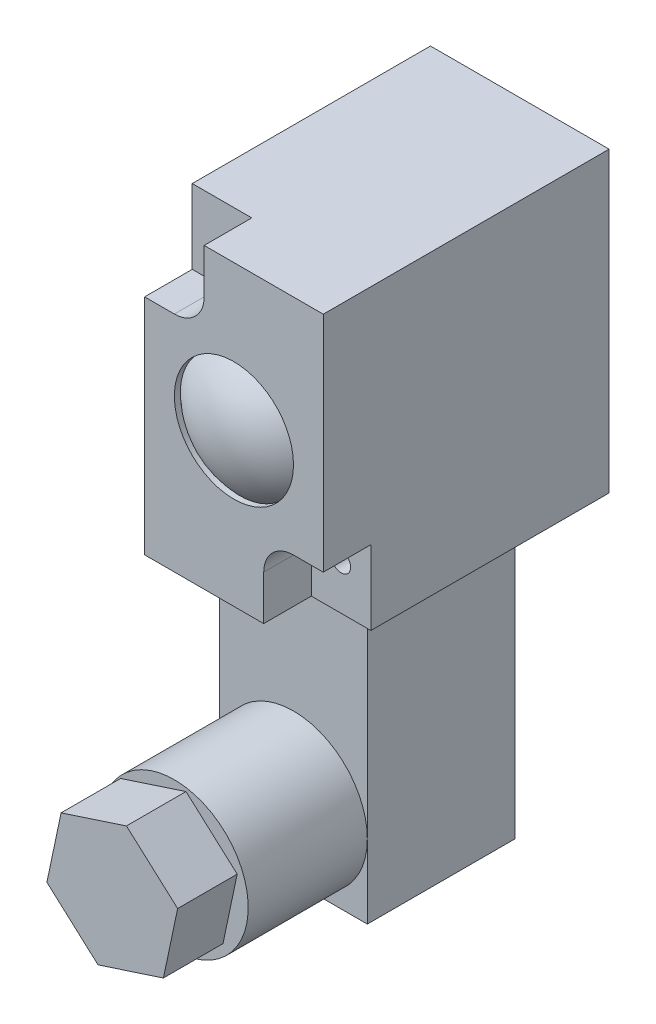
ISO-10303-21;
HEADER;
FILE_DESCRIPTION(('STEP AP214'),'2;1');
FILE_NAME('part.step','',(''),(''),'','','');
FILE_SCHEMA(('AUTOMOTIVE_DESIGN { 1 0 10303 214 1 1 1 1 }'));
ENDSEC;
DATA;
#1=APPLICATION_CONTEXT('core data for automotive mechanical design processes');
#2=APPLICATION_PROTOCOL_DEFINITION('international standard','automotive_design',2000,#1);
#3=PRODUCT_CONTEXT('',#1,'mechanical');
#4=PRODUCT('Part','Part','',(#3));
#5=PRODUCT_RELATED_PRODUCT_CATEGORY('part','',(#4));
#6=PRODUCT_DEFINITION_FORMATION('','',#4);
#7=PRODUCT_DEFINITION_CONTEXT('part definition',#1,'design');
#8=PRODUCT_DEFINITION('design','',#6,#7);
#9=PRODUCT_DEFINITION_SHAPE('','',#8);
#10=(LENGTH_UNIT() NAMED_UNIT(*) SI_UNIT(.MILLI.,.METRE.));
#11=(NAMED_UNIT(*) PLANE_ANGLE_UNIT() SI_UNIT($,.RADIAN.));
#12=(NAMED_UNIT(*) SI_UNIT($,.STERADIAN.) SOLID_ANGLE_UNIT());
#13=UNCERTAINTY_MEASURE_WITH_UNIT(LENGTH_MEASURE(1.E-05),#10,'distance_accuracy_value','');
#14=(GEOMETRIC_REPRESENTATION_CONTEXT(3) GLOBAL_UNCERTAINTY_ASSIGNED_CONTEXT((#13)) GLOBAL_UNIT_ASSIGNED_CONTEXT((#10,
#11,#12)) REPRESENTATION_CONTEXT('',''));
#15=CARTESIAN_POINT('',(0.,0.,0.));
#16=DIRECTION('',(0.,0.,1.));
#17=DIRECTION('',(1.,0.,0.));
#18=AXIS2_PLACEMENT_3D('',#15,#16,#17);
#19=CARTESIAN_POINT('',(13.194757792364,-32.545120962409,43.18));
#20=DIRECTION('',(0.,0.,-1.));
#21=DIRECTION('',(-1.,0.,0.));
#22=AXIS2_PLACEMENT_3D('',#19,#20,#21);
#23=PLANE('',#22);
#24=DIRECTION('',(0.744118556587466,-0.668047583441619,0.));
#25=VECTOR('',#24,1.);
#26=CARTESIAN_POINT('',(16.2228255803438,-18.1964576516782,43.18));
#27=LINE('',#26,#25);
#28=CARTESIAN_POINT('',(16.2228255803446,-18.1964576516783,43.18));
#29=VERTEX_POINT('',#28);
#30=CARTESIAN_POINT('',(10.7666890586184,-13.2981000096086,43.18));
#31=VERTEX_POINT('',#30);
#32=EDGE_CURVE('E305',#29,#31,#27,.F.);
#33=ORIENTED_EDGE('',*,*,#32,.T.);
#34=DIRECTION('',(0.95060545649098,0.310401781711342,0.));
#35=VECTOR('',#34,1.);
#36=CARTESIAN_POINT('',(10.7666890586182,-13.2981000096088,43.18));
#37=LINE('',#36,#35);
#38=CARTESIAN_POINT('',(3.79651864290125,-15.5740740229037,43.18));
#39=VERTEX_POINT('',#38);
#40=EDGE_CURVE('E275',#31,#39,#37,.F.);
#41=ORIENTED_EDGE('',*,*,#40,.T.);
#42=DIRECTION('',(0.20648689990351,0.978449365152964,0.));
#43=VECTOR('',#42,1.);
#44=CARTESIAN_POINT('',(3.7965186429012,-15.5740740229036,43.1800000000001));
#45=LINE('',#44,#43);
#46=CARTESIAN_POINT('',(2.2824847489097,-22.748405678269,43.18));
#47=VERTEX_POINT('',#46);
#48=EDGE_CURVE('E284',#39,#47,#45,.F.);
#49=ORIENTED_EDGE('',*,*,#48,.T.);
#50=DIRECTION('',(-0.744118556587466,0.668047583441619,0.));
#51=VECTOR('',#50,1.);
#52=CARTESIAN_POINT('',(2.28248474890969,-22.748405678269,43.18));
#53=LINE('',#52,#51);
#54=CARTESIAN_POINT('',(7.73862127063732,-27.6467633203396,43.18));
#55=VERTEX_POINT('',#54);
#56=EDGE_CURVE('E290',#47,#55,#53,.F.);
#57=ORIENTED_EDGE('',*,*,#56,.T.);
#58=DIRECTION('',(-0.95060545649098,-0.310401781711342,0.));
#59=VECTOR('',#58,1.);
#60=CARTESIAN_POINT('',(7.7386212706384,-27.6467633203389,43.18));
#61=LINE('',#60,#59);
#62=CARTESIAN_POINT('',(14.7087916863555,-25.3707893070437,43.18));
#63=VERTEX_POINT('',#62);
#64=EDGE_CURVE('E296',#55,#63,#61,.F.);
#65=ORIENTED_EDGE('',*,*,#64,.T.);
#66=DIRECTION('',(-0.20648689990351,-0.978449365152964,0.));
#67=VECTOR('',#66,1.);
#68=CARTESIAN_POINT('',(14.7087916863555,-25.3707893070436,43.18));
#69=LINE('',#68,#67);
#70=EDGE_CURVE('E302',#63,#29,#69,.F.);
#71=ORIENTED_EDGE('',*,*,#70,.T.);
#72=EDGE_LOOP('',(#33,#41,#49,#57,#65,#71));
#73=FACE_BOUND('',#72,.T.);
#74=ADVANCED_FACE('F16',(#73),#23,.F.);
#75=CARTESIAN_POINT('',(16.2228255803438,-18.1964576516782,43.18));
#76=DIRECTION('',(-0.668047583441619,-0.744118556587466,0.));
#77=DIRECTION('',(0.744118556587466,-0.668047583441619,0.));
#78=AXIS2_PLACEMENT_3D('',#75,#76,#77);
#79=PLANE('',#78);
#80=DIRECTION('',(0.,0.,1.));
#81=VECTOR('',#80,1.);
#82=CARTESIAN_POINT('',(10.7666890586182,-13.2981000096088,43.18));
#83=LINE('',#82,#81);
#84=CARTESIAN_POINT('',(10.7666890586184,-13.2981000096086,36.83));
#85=VERTEX_POINT('',#84);
#86=EDGE_CURVE('E278',#85,#31,#83,.T.);
#87=ORIENTED_EDGE('',*,*,#86,.T.);
#88=ORIENTED_EDGE('',*,*,#32,.F.);
#89=DIRECTION('',(0.,0.,1.));
#90=VECTOR('',#89,1.);
#91=CARTESIAN_POINT('',(16.2228255803469,-18.1964576516788,43.18));
#92=LINE('',#91,#90);
#93=CARTESIAN_POINT('',(16.2228255803447,-18.1964576516784,36.83));
#94=VERTEX_POINT('',#93);
#95=EDGE_CURVE('E299',#29,#94,#92,.F.);
#96=ORIENTED_EDGE('',*,*,#95,.T.);
#97=DIRECTION('',(0.744118556587526,-0.668047583441551,0.));
#98=VECTOR('',#97,1.);
#99=CARTESIAN_POINT('',(10.7666890586182,-13.2981000096088,36.83));
#100=LINE('',#99,#98);
#101=EDGE_CURVE('E270',#85,#94,#100,.T.);
#102=ORIENTED_EDGE('',*,*,#101,.F.);
#103=EDGE_LOOP('',(#87,#88,#96,#102));
#104=FACE_BOUND('',#103,.T.);
#105=ADVANCED_FACE('F660',(#104),#79,.F.);
#106=CARTESIAN_POINT('',(14.7087916863555,-25.3707893070436,43.18));
#107=DIRECTION('',(-0.978449365152964,0.20648689990351,0.));
#108=DIRECTION('',(-0.20648689990351,-0.978449365152964,0.));
#109=AXIS2_PLACEMENT_3D('',#106,#107,#108);
#110=PLANE('',#109);
#111=ORIENTED_EDGE('',*,*,#95,.F.);
#112=ORIENTED_EDGE('',*,*,#70,.F.);
#113=DIRECTION('',(0.,0.,1.));
#114=VECTOR('',#113,1.);
#115=CARTESIAN_POINT('',(14.7087916863555,-25.3707893070435,43.18));
#116=LINE('',#115,#114);
#117=CARTESIAN_POINT('',(14.7087916863547,-25.3707893070439,36.83));
#118=VERTEX_POINT('',#117);
#119=EDGE_CURVE('E293',#63,#118,#116,.F.);
#120=ORIENTED_EDGE('',*,*,#119,.T.);
#121=DIRECTION('',(-0.206486899903502,-0.978449365152966,0.));
#122=VECTOR('',#121,1.);
#123=CARTESIAN_POINT('',(16.222825580344,-18.1964576516782,36.83));
#124=LINE('',#123,#122);
#125=EDGE_CURVE('E268',#94,#118,#124,.T.);
#126=ORIENTED_EDGE('',*,*,#125,.F.);
#127=EDGE_LOOP('',(#111,#112,#120,#126));
#128=FACE_BOUND('',#127,.T.);
#129=ADVANCED_FACE('F657',(#128),#110,.F.);
#130=CARTESIAN_POINT('',(7.7386212706384,-27.6467633203389,43.18));
#131=DIRECTION('',(-0.310401781711342,0.95060545649098,0.));
#132=DIRECTION('',(-0.95060545649098,-0.310401781711342,0.));
#133=AXIS2_PLACEMENT_3D('',#130,#131,#132);
#134=PLANE('',#133);
#135=ORIENTED_EDGE('',*,*,#119,.F.);
#136=ORIENTED_EDGE('',*,*,#64,.F.);
#137=DIRECTION('',(0.,0.,1.));
#138=VECTOR('',#137,1.);
#139=CARTESIAN_POINT('',(7.73862127063698,-27.6467633203405,43.18));
#140=LINE('',#139,#138);
#141=CARTESIAN_POINT('',(7.73862127063578,-27.6467633203398,36.83));
#142=VERTEX_POINT('',#141);
#143=EDGE_CURVE('E287',#55,#142,#140,.F.);
#144=ORIENTED_EDGE('',*,*,#143,.T.);
#145=DIRECTION('',(-0.950605456490985,-0.310401781711326,0.));
#146=VECTOR('',#145,1.);
#147=CARTESIAN_POINT('',(14.7087916863526,-25.3707893070436,36.83));
#148=LINE('',#147,#146);
#149=EDGE_CURVE('E266',#118,#142,#148,.T.);
#150=ORIENTED_EDGE('',*,*,#149,.F.);
#151=EDGE_LOOP('',(#135,#136,#144,#150));
#152=FACE_BOUND('',#151,.T.);
#153=ADVANCED_FACE('F653',(#152),#134,.F.);
#154=CARTESIAN_POINT('',(2.28248474890969,-22.748405678269,43.18));
#155=DIRECTION('',(0.668047583441619,0.744118556587466,0.));
#156=DIRECTION('',(-0.744118556587466,0.668047583441619,0.));
#157=AXIS2_PLACEMENT_3D('',#154,#155,#156);
#158=PLANE('',#157);
#159=ORIENTED_EDGE('',*,*,#143,.F.);
#160=ORIENTED_EDGE('',*,*,#56,.F.);
#161=DIRECTION('',(0.,0.,1.));
#162=VECTOR('',#161,1.);
#163=CARTESIAN_POINT('',(2.28248474890974,-22.748405678269,43.1800000000001));
#164=LINE('',#163,#162);
#165=CARTESIAN_POINT('',(2.2824847489097,-22.748405678269,36.83));
#166=VERTEX_POINT('',#165);
#167=EDGE_CURVE('E281',#47,#166,#164,.F.);
#168=ORIENTED_EDGE('',*,*,#167,.T.);
#169=DIRECTION('',(-0.744118556587464,0.66804758344162,0.));
#170=VECTOR('',#169,1.);
#171=CARTESIAN_POINT('',(7.73862127063518,-27.6467633203389,36.83));
#172=LINE('',#171,#170);
#173=EDGE_CURVE('E264',#142,#166,#172,.T.);
#174=ORIENTED_EDGE('',*,*,#173,.F.);
#175=EDGE_LOOP('',(#159,#160,#168,#174));
#176=FACE_BOUND('',#175,.T.);
#177=ADVANCED_FACE('F649',(#176),#158,.F.);
#178=CARTESIAN_POINT('',(3.7965186429012,-15.5740740229036,43.1800000000001));
#179=DIRECTION('',(0.978449365152964,-0.20648689990351,0.));
#180=DIRECTION('',(0.20648689990351,0.978449365152964,0.));
#181=AXIS2_PLACEMENT_3D('',#178,#179,#180);
#182=PLANE('',#181);
#183=ORIENTED_EDGE('',*,*,#167,.F.);
#184=ORIENTED_EDGE('',*,*,#48,.F.);
#185=DIRECTION('',(0.,0.,1.));
#186=VECTOR('',#185,1.);
#187=CARTESIAN_POINT('',(3.79651864290138,-15.5740740229041,43.18));
#188=LINE('',#187,#186);
#189=CARTESIAN_POINT('',(3.79651864290125,-15.5740740229037,36.83));
#190=VERTEX_POINT('',#189);
#191=EDGE_CURVE('E272',#39,#190,#188,.F.);
#192=ORIENTED_EDGE('',*,*,#191,.T.);
#193=DIRECTION('',(0.206486899903517,0.978449365152962,0.));
#194=VECTOR('',#193,1.);
#195=CARTESIAN_POINT('',(2.28248474890969,-22.748405678269,36.83));
#196=LINE('',#195,#194);
#197=EDGE_CURVE('E262',#166,#190,#196,.T.);
#198=ORIENTED_EDGE('',*,*,#197,.F.);
#199=EDGE_LOOP('',(#183,#184,#192,#198));
#200=FACE_BOUND('',#199,.T.);
#201=ADVANCED_FACE('F645',(#200),#182,.F.);
#202=CARTESIAN_POINT('',(10.7666890586182,-13.2981000096088,43.18));
#203=DIRECTION('',(0.310401781711342,-0.95060545649098,0.));
#204=DIRECTION('',(0.95060545649098,0.310401781711342,0.));
#205=AXIS2_PLACEMENT_3D('',#202,#203,#204);
#206=PLANE('',#205);
#207=ORIENTED_EDGE('',*,*,#191,.F.);
#208=ORIENTED_EDGE('',*,*,#40,.F.);
#209=ORIENTED_EDGE('',*,*,#86,.F.);
#210=DIRECTION('',(0.950605456491004,0.310401781711269,0.));
#211=VECTOR('',#210,1.);
#212=CARTESIAN_POINT('',(3.7965186429012,-15.5740740229036,36.83));
#213=LINE('',#212,#211);
#214=EDGE_CURVE('E259',#190,#85,#213,.T.);
#215=ORIENTED_EDGE('',*,*,#214,.F.);
#216=EDGE_LOOP('',(#207,#208,#209,#215));
#217=FACE_BOUND('',#216,.T.);
#218=ADVANCED_FACE('F642',(#217),#206,.F.);
#219=CARTESIAN_POINT('',(9.52500000000023,-26.0350000000001,15.9787842316413));
#220=DIRECTION('',(0.,-1.,0.));
#221=DIRECTION('',(1.,0.,0.));
#222=AXIS2_PLACEMENT_3D('',#219,#220,#221);
#223=PLANE('',#222);
#224=CARTESIAN_POINT('',(9.52500000000023,-26.0350000000001,15.9787842316413));
#225=DIRECTION('',(0.,-1.,0.));
#226=DIRECTION('',(1.,0.,0.));
#227=AXIS2_PLACEMENT_3D('',#224,#225,#226);
#228=CIRCLE('',#227,2.74911913483342);
#229=CARTESIAN_POINT('',(12.2741191348336,-26.0350000000001,15.9787842316413));
#230=VERTEX_POINT('',#229);
#231=EDGE_CURVE('E19',#230,#230,#228,.T.);
#232=ORIENTED_EDGE('',*,*,#231,.T.);
#233=EDGE_LOOP('',(#232));
#234=FACE_BOUND('',#233,.T.);
#235=ADVANCED_FACE('F349',(#234),#223,.T.);
#236=CARTESIAN_POINT('',(3.17499999999971,27.0002,19.05));
#237=DIRECTION('',(0.,0.,1.));
#238=DIRECTION('',(1.,0.,0.));
#239=AXIS2_PLACEMENT_3D('',#236,#237,#238);
#240=PLANE('',#239);
#241=CARTESIAN_POINT('',(3.17499999999971,27.0002,19.05));
#242=DIRECTION('',(0.,0.,1.));
#243=DIRECTION('',(1.,0.,0.));
#244=AXIS2_PLACEMENT_3D('',#241,#242,#243);
#245=CIRCLE('',#244,1.016);
#246=CARTESIAN_POINT('',(4.19099999999971,27.0002,19.05));
#247=VERTEX_POINT('',#246);
#248=EDGE_CURVE('E178',#247,#247,#245,.T.);
#249=ORIENTED_EDGE('',*,*,#248,.T.);
#250=EDGE_LOOP('',(#249));
#251=FACE_BOUND('',#250,.T.);
#252=ADVANCED_FACE('F636',(#251),#240,.T.);
#253=CARTESIAN_POINT('',(9.52499999999679,-20.7010000000006,36.83));
#254=DIRECTION('',(0.,0.,1.));
#255=DIRECTION('',(1.,0.,0.));
#256=AXIS2_PLACEMENT_3D('',#253,#254,#255);
#257=PLANE('',#256);
#258=ORIENTED_EDGE('',*,*,#197,.T.);
#259=ORIENTED_EDGE('',*,*,#214,.T.);
#260=ORIENTED_EDGE('',*,*,#101,.T.);
#261=ORIENTED_EDGE('',*,*,#125,.T.);
#262=ORIENTED_EDGE('',*,*,#149,.T.);
#263=ORIENTED_EDGE('',*,*,#173,.T.);
#264=EDGE_LOOP('',(#258,#259,#260,#261,#262,#263));
#265=FACE_BOUND('',#264,.T.);
#266=CARTESIAN_POINT('',(9.52499999999679,-20.7010000000006,36.83));
#267=DIRECTION('',(0.,0.,-1.));
#268=DIRECTION('',(-1.,0.,0.));
#269=AXIS2_PLACEMENT_3D('',#266,#267,#268);
#270=CIRCLE('',#269,7.87400000000004);
#271=CARTESIAN_POINT('',(1.65099999999674,-20.7010000000006,36.83));
#272=VERTEX_POINT('',#271);
#273=EDGE_CURVE('E177',#272,#272,#270,.T.);
#274=ORIENTED_EDGE('',*,*,#273,.F.);
#275=EDGE_LOOP('',(#274));
#276=FACE_BOUND('',#275,.T.);
#277=ADVANCED_FACE('F355',(#265,#276),#257,.T.);
#278=CARTESIAN_POINT('',(9.52500000000023,-26.0350000000001,15.9787842316413));
#279=DIRECTION('',(0.,-1.,0.));
#280=DIRECTION('',(1.,0.,0.));
#281=AXIS2_PLACEMENT_3D('',#278,#279,#280);
#282=CYLINDRICAL_SURFACE('',#281,2.74911913483342);
#283=ORIENTED_EDGE('',*,*,#231,.F.);
#284=EDGE_LOOP('',(#283));
#285=FACE_BOUND('',#284,.T.);
#286=CARTESIAN_POINT('',(9.52500000000023,-28.5750000000001,15.9787842316413));
#287=DIRECTION('',(0.,-1.,0.));
#288=DIRECTION('',(1.,0.,0.));
#289=AXIS2_PLACEMENT_3D('',#286,#287,#288);
#290=CIRCLE('',#289,2.74911913483342);
#291=CARTESIAN_POINT('',(12.2741191348337,-28.5750000000001,15.9787842316413));
#292=VERTEX_POINT('',#291);
#293=EDGE_CURVE('E188',#292,#292,#290,.T.);
#294=ORIENTED_EDGE('',*,*,#293,.T.);
#295=EDGE_LOOP('',(#294));
#296=FACE_BOUND('',#295,.T.);
#297=ADVANCED_FACE('F351',(#285,#296),#282,.F.);
#298=CARTESIAN_POINT('',(3.17499999999971,27.0002,19.05));
#299=DIRECTION('',(0.,0.,1.));
#300=DIRECTION('',(1.,0.,0.));
#301=AXIS2_PLACEMENT_3D('',#298,#299,#300);
#302=CYLINDRICAL_SURFACE('',#301,1.016);
#303=ORIENTED_EDGE('',*,*,#248,.F.);
#304=EDGE_LOOP('',(#303));
#305=FACE_BOUND('',#304,.T.);
#306=CARTESIAN_POINT('',(3.17499999999971,27.0002,25.4));
#307=DIRECTION('',(0.,0.,1.));
#308=DIRECTION('',(1.,0.,0.));
#309=AXIS2_PLACEMENT_3D('',#306,#307,#308);
#310=CIRCLE('',#309,1.016);
#311=CARTESIAN_POINT('',(4.19099999999971,27.0002,25.4));
#312=VERTEX_POINT('',#311);
#313=EDGE_CURVE('E199',#312,#312,#310,.T.);
#314=ORIENTED_EDGE('',*,*,#313,.T.);
#315=EDGE_LOOP('',(#314));
#316=FACE_BOUND('',#315,.T.);
#317=ADVANCED_FACE('F354',(#305,#316),#302,.F.);
#318=CARTESIAN_POINT('',(1.65099999999996,-28.575,24.13));
#319=DIRECTION('',(0.,0.,-1.));
#320=DIRECTION('',(-1.,0.,0.));
#321=AXIS2_PLACEMENT_3D('',#318,#319,#320);
#322=PLANE('',#321);
#323=DIRECTION('',(-1.,0.,0.));
#324=VECTOR('',#323,1.);
#325=CARTESIAN_POINT('',(1.65099999999996,-28.575,24.13));
#326=LINE('',#325,#324);
#327=CARTESIAN_POINT('',(9.52499999999835,-28.5750000000003,24.13));
#328=VERTEX_POINT('',#327);
#329=CARTESIAN_POINT('',(17.3989999999979,-28.575,24.13));
#330=VERTEX_POINT('',#329);
#331=EDGE_CURVE('E171',#328,#330,#326,.F.);
#332=ORIENTED_EDGE('',*,*,#331,.T.);
#333=DIRECTION('',(0.,-1.,0.));
#334=VECTOR('',#333,1.);
#335=CARTESIAN_POINT('',(17.3989999999968,-28.575,24.13));
#336=LINE('',#335,#334);
#337=CARTESIAN_POINT('',(17.3989999999969,-20.7010000000003,24.13));
#338=VERTEX_POINT('',#337);
#339=EDGE_CURVE('E173',#330,#338,#336,.F.);
#340=ORIENTED_EDGE('',*,*,#339,.T.);
#341=CARTESIAN_POINT('',(9.52499999999679,-20.7010000000006,24.13));
#342=DIRECTION('',(0.,0.,-1.));
#343=DIRECTION('',(-1.,0.,0.));
#344=AXIS2_PLACEMENT_3D('',#341,#342,#343);
#345=CIRCLE('',#344,7.87400000000004);
#346=EDGE_CURVE('E167',#328,#338,#345,.F.);
#347=ORIENTED_EDGE('',*,*,#346,.F.);
#348=EDGE_LOOP('',(#332,#340,#347));
#349=FACE_BOUND('',#348,.T.);
#350=ADVANCED_FACE('F169',(#349),#322,.F.);
#351=CARTESIAN_POINT('',(9.52499999999679,-20.7010000000006,36.83));
#352=DIRECTION('',(0.,0.,-1.));
#353=DIRECTION('',(-1.,0.,0.));
#354=AXIS2_PLACEMENT_3D('',#351,#352,#353);
#355=CYLINDRICAL_SURFACE('',#354,7.87400000000004);
#356=ORIENTED_EDGE('',*,*,#346,.T.);
#357=CARTESIAN_POINT('',(9.52499999999679,-20.7010000000006,24.13));
#358=DIRECTION('',(0.,0.,-1.));
#359=DIRECTION('',(-1.,0.,0.));
#360=AXIS2_PLACEMENT_3D('',#357,#358,#359);
#361=CIRCLE('',#360,7.87400000000004);
#362=CARTESIAN_POINT('',(1.65099999999664,-20.7010000000003,24.13));
#363=VERTEX_POINT('',#362);
#364=EDGE_CURVE('E183',#338,#363,#361,.F.);
#365=ORIENTED_EDGE('',*,*,#364,.T.);
#366=CARTESIAN_POINT('',(9.52499999999679,-20.7010000000006,24.13));
#367=DIRECTION('',(0.,0.,-1.));
#368=DIRECTION('',(-1.,0.,0.));
#369=AXIS2_PLACEMENT_3D('',#366,#367,#368);
#370=CIRCLE('',#369,7.87400000000004);
#371=EDGE_CURVE('E180',#363,#328,#370,.F.);
#372=ORIENTED_EDGE('',*,*,#371,.T.);
#373=EDGE_LOOP('',(#356,#365,#372));
#374=FACE_BOUND('',#373,.T.);
#375=ORIENTED_EDGE('',*,*,#273,.T.);
#376=EDGE_LOOP('',(#375));
#377=FACE_BOUND('',#376,.T.);
#378=ADVANCED_FACE('F181',(#374,#377),#355,.T.);
#379=CARTESIAN_POINT('',(1.65099999999996,-28.575,24.13));
#380=DIRECTION('',(0.,0.,-1.));
#381=DIRECTION('',(-1.,0.,0.));
#382=AXIS2_PLACEMENT_3D('',#379,#380,#381);
#383=PLANE('',#382);
#384=DIRECTION('',(0.,1.,0.));
#385=VECTOR('',#384,1.);
#386=CARTESIAN_POINT('',(1.65099999999652,-28.575,24.13));
#387=LINE('',#386,#385);
#388=CARTESIAN_POINT('',(1.65099999999709,-28.575,24.13));
#389=VERTEX_POINT('',#388);
#390=EDGE_CURVE('E202',#363,#389,#387,.F.);
#391=ORIENTED_EDGE('',*,*,#390,.T.);
#392=DIRECTION('',(-1.,0.,0.));
#393=VECTOR('',#392,1.);
#394=CARTESIAN_POINT('',(1.65099999999996,-28.575,24.13));
#395=LINE('',#394,#393);
#396=EDGE_CURVE('E195',#389,#328,#395,.F.);
#397=ORIENTED_EDGE('',*,*,#396,.T.);
#398=ORIENTED_EDGE('',*,*,#371,.F.);
#399=EDGE_LOOP('',(#391,#397,#398));
#400=FACE_BOUND('',#399,.T.);
#401=ADVANCED_FACE('F201',(#400),#383,.F.);
#402=CARTESIAN_POINT('',(1.65099999999996,-28.575,24.13));
#403=DIRECTION('',(0.,1.,0.));
#404=DIRECTION('',(-1.,0.,0.));
#405=AXIS2_PLACEMENT_3D('',#402,#403,#404);
#406=PLANE('',#405);
#407=DIRECTION('',(1.,0.,0.));
#408=VECTOR('',#407,1.);
#409=CARTESIAN_POINT('',(1.65099999999652,-28.575,8.382));
#410=LINE('',#409,#408);
#411=CARTESIAN_POINT('',(1.65099999999654,-28.575,8.382));
#412=VERTEX_POINT('',#411);
#413=CARTESIAN_POINT('',(17.3989999999968,-28.575,8.382));
#414=VERTEX_POINT('',#413);
#415=EDGE_CURVE('E241',#412,#414,#410,.T.);
#416=ORIENTED_EDGE('',*,*,#415,.T.);
#417=DIRECTION('',(0.,0.,1.));
#418=VECTOR('',#417,1.);
#419=CARTESIAN_POINT('',(17.3989999999968,-28.575,8.382));
#420=LINE('',#419,#418);
#421=EDGE_CURVE('E198',#414,#330,#420,.T.);
#422=ORIENTED_EDGE('',*,*,#421,.T.);
#423=ORIENTED_EDGE('',*,*,#331,.F.);
#424=ORIENTED_EDGE('',*,*,#396,.F.);
#425=DIRECTION('',(0.,0.,1.));
#426=VECTOR('',#425,1.);
#427=CARTESIAN_POINT('',(1.65099999999652,-28.575,8.382));
#428=LINE('',#427,#426);
#429=EDGE_CURVE('E256',#389,#412,#428,.F.);
#430=ORIENTED_EDGE('',*,*,#429,.T.);
#431=EDGE_LOOP('',(#416,#422,#423,#424,#430));
#432=FACE_BOUND('',#431,.T.);
#433=ORIENTED_EDGE('',*,*,#293,.F.);
#434=EDGE_LOOP('',(#433));
#435=FACE_BOUND('',#434,.T.);
#436=ADVANCED_FACE('F192',(#432,#435),#406,.F.);
#437=CARTESIAN_POINT('',(15.8749999999969,4.74979999999997,19.05));
#438=DIRECTION('',(0.,0.,1.));
#439=DIRECTION('',(1.,0.,0.));
#440=AXIS2_PLACEMENT_3D('',#437,#438,#439);
#441=PLANE('',#440);
#442=CARTESIAN_POINT('',(15.8749999999969,4.74979999999997,19.05));
#443=DIRECTION('',(0.,0.,1.));
#444=DIRECTION('',(1.,0.,0.));
#445=AXIS2_PLACEMENT_3D('',#442,#443,#444);
#446=CIRCLE('',#445,1.01600000000001);
#447=CARTESIAN_POINT('',(16.8909999999969,4.74979999999997,19.05));
#448=VERTEX_POINT('',#447);
#449=EDGE_CURVE('E255',#448,#448,#446,.T.);
#450=ORIENTED_EDGE('',*,*,#449,.T.);
#451=EDGE_LOOP('',(#450));
#452=FACE_BOUND('',#451,.T.);
#453=ADVANCED_FACE('F359',(#452),#441,.T.);
#454=CARTESIAN_POINT('',(9.52500000000001,16.2522572947517,23.1775));
#455=DIRECTION('',(1.,0.,0.));
#456=DIRECTION('',(0.,0.,-1.));
#457=AXIS2_PLACEMENT_3D('',#454,#455,#456);
#458=SPHERICAL_SURFACE('',#457,9.20750000000001);
#459=CARTESIAN_POINT('',(9.52499999999967,16.2522572947517,29.845));
#460=DIRECTION('',(0.,0.,1.));
#461=DIRECTION('',(1.,0.,0.));
#462=AXIS2_PLACEMENT_3D('',#459,#460,#461);
#463=CIRCLE('',#462,6.35000000000004);
#464=CARTESIAN_POINT('',(15.8749999999997,16.2522572947517,29.845));
#465=VERTEX_POINT('',#464);
#466=EDGE_CURVE('E332',#465,#465,#463,.T.);
#467=ORIENTED_EDGE('',*,*,#466,.T.);
#468=EDGE_LOOP('',(#467));
#469=FACE_BOUND('',#468,.T.);
#470=ADVANCED_FACE('F366',(#469),#458,.T.);
#471=CARTESIAN_POINT('',(3.17499999999971,27.0002,25.4));
#472=DIRECTION('',(0.,0.,-1.));
#473=DIRECTION('',(-1.,0.,0.));
#474=AXIS2_PLACEMENT_3D('',#471,#472,#473);
#475=PLANE('',#474);
#476=CARTESIAN_POINT('',(3.17499999999971,27.0002,25.4));
#477=DIRECTION('',(0.,0.,1.));
#478=DIRECTION('',(1.,0.,0.));
#479=AXIS2_PLACEMENT_3D('',#476,#477,#478);
#480=CIRCLE('',#479,3.17500000000002);
#481=CARTESIAN_POINT('',(3.17499999999965,23.8252,25.4));
#482=VERTEX_POINT('',#481);
#483=CARTESIAN_POINT('',(6.34999999999962,27.0002,25.4));
#484=VERTEX_POINT('',#483);
#485=EDGE_CURVE('E328',#482,#484,#480,.T.);
#486=ORIENTED_EDGE('',*,*,#485,.T.);
#487=DIRECTION('',(0.,1.,0.));
#488=VECTOR('',#487,1.);
#489=CARTESIAN_POINT('',(6.34999999999963,32.5382037430358,25.4));
#490=LINE('',#489,#488);
#491=CARTESIAN_POINT('',(6.34999999999969,31.75,25.4));
#492=VERTEX_POINT('',#491);
#493=EDGE_CURVE('E511',#484,#492,#490,.T.);
#494=ORIENTED_EDGE('',*,*,#493,.T.);
#495=DIRECTION('',(1.,0.,0.));
#496=VECTOR('',#495,1.);
#497=CARTESIAN_POINT('',(-3.33066907387547E-13,31.75,25.4));
#498=LINE('',#497,#496);
#499=CARTESIAN_POINT('',(-1.32479159642999E-12,31.75,25.4));
#500=VERTEX_POINT('',#499);
#501=EDGE_CURVE('E490',#492,#500,#498,.F.);
#502=ORIENTED_EDGE('',*,*,#501,.T.);
#503=DIRECTION('',(0.,1.,0.));
#504=VECTOR('',#503,1.);
#505=CARTESIAN_POINT('',(-3.55260793005741E-12,0.,25.4));
#506=LINE('',#505,#504);
#507=CARTESIAN_POINT('',(-1.38677849501506E-12,23.8252,25.4));
#508=VERTEX_POINT('',#507);
#509=EDGE_CURVE('E335',#500,#508,#506,.F.);
#510=ORIENTED_EDGE('',*,*,#509,.T.);
#511=DIRECTION('',(1.,0.,0.));
#512=VECTOR('',#511,1.);
#513=CARTESIAN_POINT('',(3.17499999999993,23.8252,25.4));
#514=LINE('',#513,#512);
#515=EDGE_CURVE('E522',#508,#482,#514,.T.);
#516=ORIENTED_EDGE('',*,*,#515,.T.);
#517=EDGE_LOOP('',(#486,#494,#502,#510,#516));
#518=FACE_BOUND('',#517,.T.);
#519=ORIENTED_EDGE('',*,*,#313,.F.);
#520=EDGE_LOOP('',(#519));
#521=FACE_BOUND('',#520,.T.);
#522=ADVANCED_FACE('F448',(#518,#521),#475,.F.);
#523=CARTESIAN_POINT('',(1.65099999999652,-28.575,8.382));
#524=DIRECTION('',(0.,0.,1.));
#525=DIRECTION('',(1.,0.,0.));
#526=AXIS2_PLACEMENT_3D('',#523,#524,#525);
#527=PLANE('',#526);
#528=DIRECTION('',(0.,-1.,0.));
#529=VECTOR('',#528,1.);
#530=CARTESIAN_POINT('',(17.3989999999968,-28.575,8.382));
#531=LINE('',#530,#529);
#532=CARTESIAN_POINT('',(17.3989999999969,0.,8.382));
#533=VERTEX_POINT('',#532);
#534=EDGE_CURVE('E234',#533,#414,#531,.T.);
#535=ORIENTED_EDGE('',*,*,#534,.T.);
#536=ORIENTED_EDGE('',*,*,#415,.F.);
#537=DIRECTION('',(0.,1.,0.));
#538=VECTOR('',#537,1.);
#539=CARTESIAN_POINT('',(1.65099999999652,-28.575,8.382));
#540=LINE('',#539,#538);
#541=CARTESIAN_POINT('',(1.6509999999967,0.,8.382));
#542=VERTEX_POINT('',#541);
#543=EDGE_CURVE('E252',#412,#542,#540,.T.);
#544=ORIENTED_EDGE('',*,*,#543,.T.);
#545=DIRECTION('',(-1.,0.,0.));
#546=VECTOR('',#545,1.);
#547=CARTESIAN_POINT('',(-3.5527136788005E-12,0.,8.382));
#548=LINE('',#547,#546);
#549=EDGE_CURVE('E230',#542,#533,#548,.F.);
#550=ORIENTED_EDGE('',*,*,#549,.T.);
#551=EDGE_LOOP('',(#535,#536,#544,#550));
#552=FACE_BOUND('',#551,.T.);
#553=ADVANCED_FACE('F444',(#552),#527,.F.);
#554=CARTESIAN_POINT('',(17.3989999999968,-28.575,8.382));
#555=DIRECTION('',(-1.,0.,0.));
#556=DIRECTION('',(0.,-1.,0.));
#557=AXIS2_PLACEMENT_3D('',#554,#555,#556);
#558=PLANE('',#557);
#559=DIRECTION('',(0.,1.,0.));
#560=VECTOR('',#559,1.);
#561=CARTESIAN_POINT('',(17.3989999999968,-28.575,24.13));
#562=LINE('',#561,#560);
#563=CARTESIAN_POINT('',(17.3989999999968,0.,24.13));
#564=VERTEX_POINT('',#563);
#565=EDGE_CURVE('E225',#564,#338,#562,.F.);
#566=ORIENTED_EDGE('',*,*,#565,.T.);
#567=ORIENTED_EDGE('',*,*,#339,.F.);
#568=ORIENTED_EDGE('',*,*,#421,.F.);
#569=ORIENTED_EDGE('',*,*,#534,.F.);
#570=DIRECTION('',(0.,0.,1.));
#571=VECTOR('',#570,1.);
#572=CARTESIAN_POINT('',(17.3989999999968,0.,30.4799999999999));
#573=LINE('',#572,#571);
#574=EDGE_CURVE('E221',#533,#564,#573,.T.);
#575=ORIENTED_EDGE('',*,*,#574,.T.);
#576=EDGE_LOOP('',(#566,#567,#568,#569,#575));
#577=FACE_BOUND('',#576,.T.);
#578=ADVANCED_FACE('F440',(#577),#558,.F.);
#579=CARTESIAN_POINT('',(1.65099999999996,-28.575,24.13));
#580=DIRECTION('',(0.,0.,-1.));
#581=DIRECTION('',(-1.,0.,0.));
#582=AXIS2_PLACEMENT_3D('',#579,#580,#581);
#583=PLANE('',#582);
#584=ORIENTED_EDGE('',*,*,#565,.F.);
#585=DIRECTION('',(-1.,0.,0.));
#586=VECTOR('',#585,1.);
#587=CARTESIAN_POINT('',(-3.5527136788005E-12,0.,24.13));
#588=LINE('',#587,#586);
#589=CARTESIAN_POINT('',(1.65099999999659,0.,24.13));
#590=VERTEX_POINT('',#589);
#591=EDGE_CURVE('E216',#564,#590,#588,.T.);
#592=ORIENTED_EDGE('',*,*,#591,.T.);
#593=DIRECTION('',(0.,1.,0.));
#594=VECTOR('',#593,1.);
#595=CARTESIAN_POINT('',(1.65099999999652,-28.575,24.13));
#596=LINE('',#595,#594);
#597=EDGE_CURVE('E339',#590,#363,#596,.F.);
#598=ORIENTED_EDGE('',*,*,#597,.T.);
#599=ORIENTED_EDGE('',*,*,#364,.F.);
#600=EDGE_LOOP('',(#584,#592,#598,#599));
#601=FACE_BOUND('',#600,.T.);
#602=ADVANCED_FACE('F436',(#601),#583,.F.);
#603=CARTESIAN_POINT('',(1.65099999999652,-28.575,8.382));
#604=DIRECTION('',(1.,0.,0.));
#605=DIRECTION('',(0.,1.,0.));
#606=AXIS2_PLACEMENT_3D('',#603,#604,#605);
#607=PLANE('',#606);
#608=ORIENTED_EDGE('',*,*,#543,.F.);
#609=ORIENTED_EDGE('',*,*,#429,.F.);
#610=ORIENTED_EDGE('',*,*,#390,.F.);
#611=ORIENTED_EDGE('',*,*,#597,.F.);
#612=DIRECTION('',(0.,0.,1.));
#613=VECTOR('',#612,1.);
#614=CARTESIAN_POINT('',(1.65099999999674,0.,30.4799999999999));
#615=LINE('',#614,#613);
#616=EDGE_CURVE('E212',#590,#542,#615,.F.);
#617=ORIENTED_EDGE('',*,*,#616,.T.);
#618=EDGE_LOOP('',(#608,#609,#610,#611,#617));
#619=FACE_BOUND('',#618,.T.);
#620=ADVANCED_FACE('F432',(#619),#607,.F.);
#621=CARTESIAN_POINT('',(15.8749999999969,4.74979999999997,19.05));
#622=DIRECTION('',(0.,0.,1.));
#623=DIRECTION('',(1.,0.,0.));
#624=AXIS2_PLACEMENT_3D('',#621,#622,#623);
#625=CYLINDRICAL_SURFACE('',#624,1.01600000000001);
#626=ORIENTED_EDGE('',*,*,#449,.F.);
#627=EDGE_LOOP('',(#626));
#628=FACE_BOUND('',#627,.T.);
#629=CARTESIAN_POINT('',(15.8749999999969,4.74979999999997,25.4));
#630=DIRECTION('',(0.,0.,1.));
#631=DIRECTION('',(1.,0.,0.));
#632=AXIS2_PLACEMENT_3D('',#629,#630,#631);
#633=CIRCLE('',#632,1.01600000000001);
#634=CARTESIAN_POINT('',(16.8909999999969,4.74979999999997,25.4));
#635=VERTEX_POINT('',#634);
#636=EDGE_CURVE('E215',#635,#635,#633,.T.);
#637=ORIENTED_EDGE('',*,*,#636,.T.);
#638=EDGE_LOOP('',(#637));
#639=FACE_BOUND('',#638,.T.);
#640=ADVANCED_FACE('F428',(#628,#639),#625,.F.);
#641=CARTESIAN_POINT('',(9.52499999999967,16.2522572947517,29.845));
#642=DIRECTION('',(0.,0.,1.));
#643=DIRECTION('',(1.,0.,0.));
#644=AXIS2_PLACEMENT_3D('',#641,#642,#643);
#645=CYLINDRICAL_SURFACE('',#644,6.35000000000004);
#646=ORIENTED_EDGE('',*,*,#466,.F.);
#647=EDGE_LOOP('',(#646));
#648=FACE_BOUND('',#647,.T.);
#649=CARTESIAN_POINT('',(9.52499999999967,16.2522572947517,30.4800000000001));
#650=DIRECTION('',(0.,0.,1.));
#651=DIRECTION('',(1.,0.,0.));
#652=AXIS2_PLACEMENT_3D('',#649,#650,#651);
#653=CIRCLE('',#652,6.35000000000004);
#654=CARTESIAN_POINT('',(15.8749999999997,16.2522572947517,30.4800000000001));
#655=VERTEX_POINT('',#654);
#656=EDGE_CURVE('E316',#655,#655,#653,.T.);
#657=ORIENTED_EDGE('',*,*,#656,.T.);
#658=EDGE_LOOP('',(#657));
#659=FACE_BOUND('',#658,.T.);
#660=ADVANCED_FACE('F424',(#648,#659),#645,.F.);
#661=CARTESIAN_POINT('',(-3.5527136788005E-12,0.,30.4799999999999));
#662=DIRECTION('',(1.,0.,0.));
#663=DIRECTION('',(0.,1.,0.));
#664=AXIS2_PLACEMENT_3D('',#661,#662,#663);
#665=PLANE('',#664);
#666=DIRECTION('',(0.,0.,1.));
#667=VECTOR('',#666,1.);
#668=CARTESIAN_POINT('',(-3.33066907387547E-13,23.8252,25.4));
#669=LINE('',#668,#667);
#670=CARTESIAN_POINT('',(-2.47949808832952E-12,23.8252,30.4800000000001));
#671=VERTEX_POINT('',#670);
#672=EDGE_CURVE('E520',#671,#508,#669,.F.);
#673=ORIENTED_EDGE('',*,*,#672,.T.);
#674=ORIENTED_EDGE('',*,*,#509,.F.);
#675=DIRECTION('',(0.,0.,1.));
#676=VECTOR('',#675,1.);
#677=CARTESIAN_POINT('',(-3.33066907387547E-13,31.75,30.4800000000001));
#678=LINE('',#677,#676);
#679=CARTESIAN_POINT('',(-1.11022302462516E-13,31.75,0.));
#680=VERTEX_POINT('',#679);
#681=EDGE_CURVE('E500',#500,#680,#678,.F.);
#682=ORIENTED_EDGE('',*,*,#681,.T.);
#683=DIRECTION('',(0.,1.,0.));
#684=VECTOR('',#683,1.);
#685=CARTESIAN_POINT('',(0.,31.75,0.));
#686=LINE('',#685,#684);
#687=CARTESIAN_POINT('',(0.,0.,0.));
#688=VERTEX_POINT('',#687);
#689=EDGE_CURVE('E488',#688,#680,#686,.T.);
#690=ORIENTED_EDGE('',*,*,#689,.F.);
#691=DIRECTION('',(0.,0.,1.));
#692=VECTOR('',#691,1.);
#693=CARTESIAN_POINT('',(0.,0.,30.4799999999999));
#694=LINE('',#693,#692);
#695=CARTESIAN_POINT('',(-1.77635683940025E-12,0.,30.4800000000001));
#696=VERTEX_POINT('',#695);
#697=EDGE_CURVE('E484',#688,#696,#694,.T.);
#698=ORIENTED_EDGE('',*,*,#697,.T.);
#699=DIRECTION('',(0.,1.,0.));
#700=VECTOR('',#699,1.);
#701=CARTESIAN_POINT('',(-3.5527136788005E-12,31.75,30.4800000000001));
#702=LINE('',#701,#700);
#703=EDGE_CURVE('E319',#696,#671,#702,.T.);
#704=ORIENTED_EDGE('',*,*,#703,.T.);
#705=EDGE_LOOP('',(#673,#674,#682,#690,#698,#704));
#706=FACE_BOUND('',#705,.T.);
#707=ADVANCED_FACE('F420',(#706),#665,.F.);
#708=CARTESIAN_POINT('',(3.17499999999993,23.8252,25.4));
#709=DIRECTION('',(0.,-1.,0.));
#710=DIRECTION('',(1.,0.,0.));
#711=AXIS2_PLACEMENT_3D('',#708,#709,#710);
#712=PLANE('',#711);
#713=DIRECTION('',(0.,0.,1.));
#714=VECTOR('',#713,1.);
#715=CARTESIAN_POINT('',(3.17499999999959,23.8252,25.4));
#716=LINE('',#715,#714);
#717=CARTESIAN_POINT('',(3.17499999999965,23.8252,30.4800000000001));
#718=VERTEX_POINT('',#717);
#719=EDGE_CURVE('E331',#718,#482,#716,.F.);
#720=ORIENTED_EDGE('',*,*,#719,.T.);
#721=ORIENTED_EDGE('',*,*,#515,.F.);
#722=ORIENTED_EDGE('',*,*,#672,.F.);
#723=DIRECTION('',(-1.,0.,0.));
#724=VECTOR('',#723,1.);
#725=CARTESIAN_POINT('',(-3.33066907387547E-13,23.8252,30.4800000000001));
#726=LINE('',#725,#724);
#727=EDGE_CURVE('E315',#671,#718,#726,.F.);
#728=ORIENTED_EDGE('',*,*,#727,.T.);
#729=EDGE_LOOP('',(#720,#721,#722,#728));
#730=FACE_BOUND('',#729,.T.);
#731=ADVANCED_FACE('F416',(#730),#712,.F.);
#732=CARTESIAN_POINT('',(3.17499999999971,27.0002,25.4));
#733=DIRECTION('',(0.,0.,1.));
#734=DIRECTION('',(1.,0.,0.));
#735=AXIS2_PLACEMENT_3D('',#732,#733,#734);
#736=CYLINDRICAL_SURFACE('',#735,3.17500000000002);
#737=DIRECTION('',(0.,0.,1.));
#738=VECTOR('',#737,1.);
#739=CARTESIAN_POINT('',(6.34999999999962,27.0002,25.4));
#740=LINE('',#739,#738);
#741=CARTESIAN_POINT('',(6.34999999999963,27.0002,30.4800000000001));
#742=VERTEX_POINT('',#741);
#743=EDGE_CURVE('E330',#742,#484,#740,.F.);
#744=ORIENTED_EDGE('',*,*,#743,.T.);
#745=ORIENTED_EDGE('',*,*,#485,.F.);
#746=ORIENTED_EDGE('',*,*,#719,.F.);
#747=CARTESIAN_POINT('',(3.17499999999971,27.0002,30.4800000000001));
#748=DIRECTION('',(0.,0.,1.));
#749=DIRECTION('',(1.,0.,0.));
#750=AXIS2_PLACEMENT_3D('',#747,#748,#749);
#751=CIRCLE('',#750,3.17500000000002);
#752=EDGE_CURVE('E311',#718,#742,#751,.T.);
#753=ORIENTED_EDGE('',*,*,#752,.T.);
#754=EDGE_LOOP('',(#744,#745,#746,#753));
#755=FACE_BOUND('',#754,.T.);
#756=ADVANCED_FACE('F412',(#755),#736,.F.);
#757=CARTESIAN_POINT('',(6.34999999999963,32.5382037430358,25.4));
#758=DIRECTION('',(1.,0.,0.));
#759=DIRECTION('',(0.,1.,0.));
#760=AXIS2_PLACEMENT_3D('',#757,#758,#759);
#761=PLANE('',#760);
#762=ORIENTED_EDGE('',*,*,#743,.F.);
#763=DIRECTION('',(0.,1.,0.));
#764=VECTOR('',#763,1.);
#765=CARTESIAN_POINT('',(6.34999999999963,31.75,30.4800000000001));
#766=LINE('',#765,#764);
#767=CARTESIAN_POINT('',(6.34999999999963,31.7499999999998,30.4800000000001));
#768=VERTEX_POINT('',#767);
#769=EDGE_CURVE('E314',#742,#768,#766,.T.);
#770=ORIENTED_EDGE('',*,*,#769,.T.);
#771=DIRECTION('',(0.,0.,1.));
#772=VECTOR('',#771,1.);
#773=CARTESIAN_POINT('',(6.34999999999963,31.75,30.4800000000001));
#774=LINE('',#773,#772);
#775=EDGE_CURVE('E503',#768,#492,#774,.F.);
#776=ORIENTED_EDGE('',*,*,#775,.T.);
#777=ORIENTED_EDGE('',*,*,#493,.F.);
#778=EDGE_LOOP('',(#762,#770,#776,#777));
#779=FACE_BOUND('',#778,.T.);
#780=ADVANCED_FACE('F408',(#779),#761,.F.);
#781=CARTESIAN_POINT('',(15.8749999999969,4.74979999999997,25.4));
#782=DIRECTION('',(0.,0.,1.));
#783=DIRECTION('',(1.,0.,0.));
#784=AXIS2_PLACEMENT_3D('',#781,#782,#783);
#785=CYLINDRICAL_SURFACE('',#784,3.17500000000001);
#786=DIRECTION('',(0.,0.,1.));
#787=VECTOR('',#786,1.);
#788=CARTESIAN_POINT('',(12.6999999999968,4.74979999999997,25.4));
#789=LINE('',#788,#787);
#790=CARTESIAN_POINT('',(12.6999999999968,4.74979999999997,30.4800000000001));
#791=VERTEX_POINT('',#790);
#792=CARTESIAN_POINT('',(12.6999999999968,4.74979999999997,25.4));
#793=VERTEX_POINT('',#792);
#794=EDGE_CURVE('E504',#791,#793,#789,.F.);
#795=ORIENTED_EDGE('',*,*,#794,.T.);
#796=CARTESIAN_POINT('',(15.8749999999969,4.74979999999997,25.4));
#797=DIRECTION('',(0.,0.,1.));
#798=DIRECTION('',(1.,0.,0.));
#799=AXIS2_PLACEMENT_3D('',#796,#797,#798);
#800=CIRCLE('',#799,3.17500000000001);
#801=CARTESIAN_POINT('',(15.8749999999969,7.92480000000002,25.4));
#802=VERTEX_POINT('',#801);
#803=EDGE_CURVE('E321',#793,#802,#800,.F.);
#804=ORIENTED_EDGE('',*,*,#803,.T.);
#805=DIRECTION('',(0.,0.,1.));
#806=VECTOR('',#805,1.);
#807=CARTESIAN_POINT('',(15.8749999999969,7.92480000000002,25.4));
#808=LINE('',#807,#806);
#809=CARTESIAN_POINT('',(15.8749999999969,7.92480000000002,30.4800000000001));
#810=VERTEX_POINT('',#809);
#811=EDGE_CURVE('E320',#802,#810,#808,.T.);
#812=ORIENTED_EDGE('',*,*,#811,.T.);
#813=CARTESIAN_POINT('',(15.8749999999969,4.74979999999997,30.4800000000001));
#814=DIRECTION('',(0.,0.,1.));
#815=DIRECTION('',(1.,0.,0.));
#816=AXIS2_PLACEMENT_3D('',#813,#814,#815);
#817=CIRCLE('',#816,3.17500000000001);
#818=EDGE_CURVE('E307',#810,#791,#817,.T.);
#819=ORIENTED_EDGE('',*,*,#818,.T.);
#820=EDGE_LOOP('',(#795,#804,#812,#819));
#821=FACE_BOUND('',#820,.T.);
#822=ADVANCED_FACE('F404',(#821),#785,.F.);
#823=CARTESIAN_POINT('',(12.6999999999968,4.74979999999997,25.4));
#824=DIRECTION('',(-1.,0.,0.));
#825=DIRECTION('',(0.,-1.,0.));
#826=AXIS2_PLACEMENT_3D('',#823,#824,#825);
#827=PLANE('',#826);
#828=ORIENTED_EDGE('',*,*,#794,.F.);
#829=DIRECTION('',(0.,1.,0.));
#830=VECTOR('',#829,1.);
#831=CARTESIAN_POINT('',(12.6999999999968,31.75,30.4800000000001));
#832=LINE('',#831,#830);
#833=CARTESIAN_POINT('',(12.6999999999968,0.,30.4800000000001));
#834=VERTEX_POINT('',#833);
#835=EDGE_CURVE('E310',#791,#834,#832,.F.);
#836=ORIENTED_EDGE('',*,*,#835,.T.);
#837=DIRECTION('',(0.,0.,1.));
#838=VECTOR('',#837,1.);
#839=CARTESIAN_POINT('',(12.6999999999968,0.,30.4799999999999));
#840=LINE('',#839,#838);
#841=CARTESIAN_POINT('',(12.6999999999968,0.,25.4));
#842=VERTEX_POINT('',#841);
#843=EDGE_CURVE('E249',#834,#842,#840,.F.);
#844=ORIENTED_EDGE('',*,*,#843,.T.);
#845=DIRECTION('',(0.,1.,0.));
#846=VECTOR('',#845,1.);
#847=CARTESIAN_POINT('',(12.6999999999968,4.74979999999997,25.4));
#848=LINE('',#847,#846);
#849=EDGE_CURVE('E324',#842,#793,#848,.T.);
#850=ORIENTED_EDGE('',*,*,#849,.T.);
#851=EDGE_LOOP('',(#828,#836,#844,#850));
#852=FACE_BOUND('',#851,.T.);
#853=ADVANCED_FACE('F400',(#852),#827,.F.);
#854=CARTESIAN_POINT('',(-3.33066907387547E-13,31.75,30.4800000000001));
#855=DIRECTION('',(0.,-1.,0.));
#856=DIRECTION('',(1.,0.,0.));
#857=AXIS2_PLACEMENT_3D('',#854,#855,#856);
#858=PLANE('',#857);
#859=ORIENTED_EDGE('',*,*,#775,.F.);
#860=DIRECTION('',(-1.,0.,0.));
#861=VECTOR('',#860,1.);
#862=CARTESIAN_POINT('',(-3.33066907387547E-13,31.7499999999997,30.4800000000001));
#863=LINE('',#862,#861);
#864=CARTESIAN_POINT('',(19.0499999999991,31.7499999999999,30.4800000000001));
#865=VERTEX_POINT('',#864);
#866=EDGE_CURVE('E565',#768,#865,#863,.F.);
#867=ORIENTED_EDGE('',*,*,#866,.T.);
#868=DIRECTION('',(0.,0.,1.));
#869=VECTOR('',#868,1.);
#870=CARTESIAN_POINT('',(19.0499999999969,31.75,30.4800000000001));
#871=LINE('',#870,#869);
#872=CARTESIAN_POINT('',(19.0499999999991,31.75,0.));
#873=VERTEX_POINT('',#872);
#874=EDGE_CURVE('E497',#865,#873,#871,.F.);
#875=ORIENTED_EDGE('',*,*,#874,.T.);
#876=DIRECTION('',(-1.,0.,0.));
#877=VECTOR('',#876,1.);
#878=CARTESIAN_POINT('',(0.,31.75,0.));
#879=LINE('',#878,#877);
#880=EDGE_CURVE('E485',#680,#873,#879,.F.);
#881=ORIENTED_EDGE('',*,*,#880,.F.);
#882=ORIENTED_EDGE('',*,*,#681,.F.);
#883=ORIENTED_EDGE('',*,*,#501,.F.);
#884=EDGE_LOOP('',(#859,#867,#875,#881,#882,#883));
#885=FACE_BOUND('',#884,.T.);
#886=ADVANCED_FACE('F396',(#885),#858,.F.);
#887=CARTESIAN_POINT('',(0.,31.75,0.));
#888=DIRECTION('',(0.,0.,-1.));
#889=DIRECTION('',(-1.,0.,0.));
#890=AXIS2_PLACEMENT_3D('',#887,#888,#889);
#891=PLANE('',#890);
#892=DIRECTION('',(0.,-1.,0.));
#893=VECTOR('',#892,1.);
#894=CARTESIAN_POINT('',(19.0499999999968,0.,0.));
#895=LINE('',#894,#893);
#896=CARTESIAN_POINT('',(19.0499999999976,0.,0.));
#897=VERTEX_POINT('',#896);
#898=EDGE_CURVE('E493',#873,#897,#895,.T.);
#899=ORIENTED_EDGE('',*,*,#898,.T.);
#900=DIRECTION('',(-1.,0.,0.));
#901=VECTOR('',#900,1.);
#902=CARTESIAN_POINT('',(-3.5527136788005E-12,0.,0.));
#903=LINE('',#902,#901);
#904=EDGE_CURVE('E481',#897,#688,#903,.T.);
#905=ORIENTED_EDGE('',*,*,#904,.T.);
#906=ORIENTED_EDGE('',*,*,#689,.T.);
#907=ORIENTED_EDGE('',*,*,#880,.T.);
#908=EDGE_LOOP('',(#899,#905,#906,#907));
#909=FACE_BOUND('',#908,.T.);
#910=ADVANCED_FACE('F392',(#909),#891,.T.);
#911=CARTESIAN_POINT('',(-3.5527136788005E-12,0.,30.4799999999999));
#912=DIRECTION('',(0.,1.,0.));
#913=DIRECTION('',(-1.,0.,0.));
#914=AXIS2_PLACEMENT_3D('',#911,#912,#913);
#915=PLANE('',#914);
#916=ORIENTED_EDGE('',*,*,#591,.F.);
#917=ORIENTED_EDGE('',*,*,#574,.F.);
#918=ORIENTED_EDGE('',*,*,#549,.F.);
#919=ORIENTED_EDGE('',*,*,#616,.F.);
#920=EDGE_LOOP('',(#916,#917,#918,#919));
#921=FACE_BOUND('',#920,.T.);
#922=ORIENTED_EDGE('',*,*,#843,.F.);
#923=DIRECTION('',(-1.,0.,0.));
#924=VECTOR('',#923,1.);
#925=CARTESIAN_POINT('',(-3.33066907387547E-13,0.,30.4800000000001));
#926=LINE('',#925,#924);
#927=EDGE_CURVE('E566',#834,#696,#926,.T.);
#928=ORIENTED_EDGE('',*,*,#927,.T.);
#929=ORIENTED_EDGE('',*,*,#697,.F.);
#930=ORIENTED_EDGE('',*,*,#904,.F.);
#931=DIRECTION('',(0.,0.,1.));
#932=VECTOR('',#931,1.);
#933=CARTESIAN_POINT('',(19.0499999999968,0.,30.4800000000001));
#934=LINE('',#933,#932);
#935=CARTESIAN_POINT('',(19.0499999999968,0.,25.4));
#936=VERTEX_POINT('',#935);
#937=EDGE_CURVE('E496',#897,#936,#934,.T.);
#938=ORIENTED_EDGE('',*,*,#937,.T.);
#939=DIRECTION('',(-1.,0.,0.));
#940=VECTOR('',#939,1.);
#941=CARTESIAN_POINT('',(15.8749999999969,0.,25.4));
#942=LINE('',#941,#940);
#943=EDGE_CURVE('E327',#936,#842,#942,.T.);
#944=ORIENTED_EDGE('',*,*,#943,.T.);
#945=EDGE_LOOP('',(#922,#928,#929,#930,#938,#944));
#946=FACE_BOUND('',#945,.T.);
#947=ADVANCED_FACE('F388',(#921,#946),#915,.F.);
#948=CARTESIAN_POINT('',(15.8749999999969,4.74979999999997,25.4));
#949=DIRECTION('',(0.,0.,-1.));
#950=DIRECTION('',(-1.,0.,0.));
#951=AXIS2_PLACEMENT_3D('',#948,#949,#950);
#952=PLANE('',#951);
#953=DIRECTION('',(-1.,0.,0.));
#954=VECTOR('',#953,1.);
#955=CARTESIAN_POINT('',(15.8749999999969,7.92480000000002,25.4));
#956=LINE('',#955,#954);
#957=CARTESIAN_POINT('',(19.0499999999968,7.92480000000002,25.4));
#958=VERTEX_POINT('',#957);
#959=EDGE_CURVE('E323',#958,#802,#956,.T.);
#960=ORIENTED_EDGE('',*,*,#959,.T.);
#961=ORIENTED_EDGE('',*,*,#803,.F.);
#962=ORIENTED_EDGE('',*,*,#849,.F.);
#963=ORIENTED_EDGE('',*,*,#943,.F.);
#964=DIRECTION('',(0.,-1.,0.));
#965=VECTOR('',#964,1.);
#966=CARTESIAN_POINT('',(19.0499999999968,0.,25.4));
#967=LINE('',#966,#965);
#968=EDGE_CURVE('E545',#936,#958,#967,.F.);
#969=ORIENTED_EDGE('',*,*,#968,.T.);
#970=EDGE_LOOP('',(#960,#961,#962,#963,#969));
#971=FACE_BOUND('',#970,.T.);
#972=ORIENTED_EDGE('',*,*,#636,.F.);
#973=EDGE_LOOP('',(#972));
#974=FACE_BOUND('',#973,.T.);
#975=ADVANCED_FACE('F384',(#971,#974),#952,.F.);
#976=CARTESIAN_POINT('',(15.8749999999969,7.92480000000002,25.4));
#977=DIRECTION('',(0.,1.,0.));
#978=DIRECTION('',(-1.,0.,0.));
#979=AXIS2_PLACEMENT_3D('',#976,#977,#978);
#980=PLANE('',#979);
#981=ORIENTED_EDGE('',*,*,#811,.F.);
#982=ORIENTED_EDGE('',*,*,#959,.F.);
#983=DIRECTION('',(0.,0.,1.));
#984=VECTOR('',#983,1.);
#985=CARTESIAN_POINT('',(19.0499999999968,7.92480000000002,30.4800000000001));
#986=LINE('',#985,#984);
#987=CARTESIAN_POINT('',(19.0499999999997,7.92480000000002,30.4800000000001));
#988=VERTEX_POINT('',#987);
#989=EDGE_CURVE('E25',#958,#988,#986,.T.);
#990=ORIENTED_EDGE('',*,*,#989,.T.);
#991=DIRECTION('',(-1.,0.,0.));
#992=VECTOR('',#991,1.);
#993=CARTESIAN_POINT('',(-3.33066907387547E-13,7.92480000000002,30.4800000000001));
#994=LINE('',#993,#992);
#995=EDGE_CURVE('E33',#988,#810,#994,.T.);
#996=ORIENTED_EDGE('',*,*,#995,.T.);
#997=EDGE_LOOP('',(#981,#982,#990,#996));
#998=FACE_BOUND('',#997,.T.);
#999=ADVANCED_FACE('F378',(#998),#980,.F.);
#1000=CARTESIAN_POINT('',(-3.33066907387547E-13,31.75,30.4800000000001));
#1001=DIRECTION('',(0.,0.,-1.));
#1002=DIRECTION('',(-1.,0.,0.));
#1003=AXIS2_PLACEMENT_3D('',#1000,#1001,#1002);
#1004=PLANE('',#1003);
#1005=ORIENTED_EDGE('',*,*,#835,.F.);
#1006=ORIENTED_EDGE('',*,*,#818,.F.);
#1007=ORIENTED_EDGE('',*,*,#995,.F.);
#1008=DIRECTION('',(0.,-1.,0.));
#1009=VECTOR('',#1008,1.);
#1010=CARTESIAN_POINT('',(19.0499999999968,0.,30.4800000000001));
#1011=LINE('',#1010,#1009);
#1012=EDGE_CURVE('E11',#988,#865,#1011,.F.);
#1013=ORIENTED_EDGE('',*,*,#1012,.T.);
#1014=ORIENTED_EDGE('',*,*,#866,.F.);
#1015=ORIENTED_EDGE('',*,*,#769,.F.);
#1016=ORIENTED_EDGE('',*,*,#752,.F.);
#1017=ORIENTED_EDGE('',*,*,#727,.F.);
#1018=ORIENTED_EDGE('',*,*,#703,.F.);
#1019=ORIENTED_EDGE('',*,*,#927,.F.);
#1020=EDGE_LOOP('',(#1005,#1006,#1007,#1013,#1014,#1015,#1016,#1017,#1018,#1019));
#1021=FACE_BOUND('',#1020,.T.);
#1022=ORIENTED_EDGE('',*,*,#656,.F.);
#1023=EDGE_LOOP('',(#1022));
#1024=FACE_BOUND('',#1023,.T.);
#1025=ADVANCED_FACE('F372',(#1021,#1024),#1004,.F.);
#1026=CARTESIAN_POINT('',(19.0499999999968,0.,30.4800000000001));
#1027=DIRECTION('',(-1.,0.,0.));
#1028=DIRECTION('',(0.,-1.,0.));
#1029=AXIS2_PLACEMENT_3D('',#1026,#1027,#1028);
#1030=PLANE('',#1029);
#1031=ORIENTED_EDGE('',*,*,#989,.F.);
#1032=ORIENTED_EDGE('',*,*,#968,.F.);
#1033=ORIENTED_EDGE('',*,*,#937,.F.);
#1034=ORIENTED_EDGE('',*,*,#898,.F.);
#1035=ORIENTED_EDGE('',*,*,#874,.F.);
#1036=ORIENTED_EDGE('',*,*,#1012,.F.);
#1037=EDGE_LOOP('',(#1031,#1032,#1033,#1034,#1035,#1036));
#1038=FACE_BOUND('',#1037,.T.);
#1039=ADVANCED_FACE('F370',(#1038),#1030,.F.);
#1040=CLOSED_SHELL('',(#74,#105,#129,#153,#177,#201,#218,#235,#252,#277,#297,#317,#350,#378,
#401,#436,#453,#470,#522,#553,#578,#602,#620,#640,#660,#707,#731,#756,#780,#822,#853,#886,#910,
#947,#975,#999,#1025,#1039));
#1041=MANIFOLD_SOLID_BREP('B1',#1040);
#1042=ADVANCED_BREP_SHAPE_REPRESENTATION('',(#18,#1041),#14);
#1043=SHAPE_DEFINITION_REPRESENTATION(#9,#1042);
ENDSEC;
END-ISO-10303-21;
